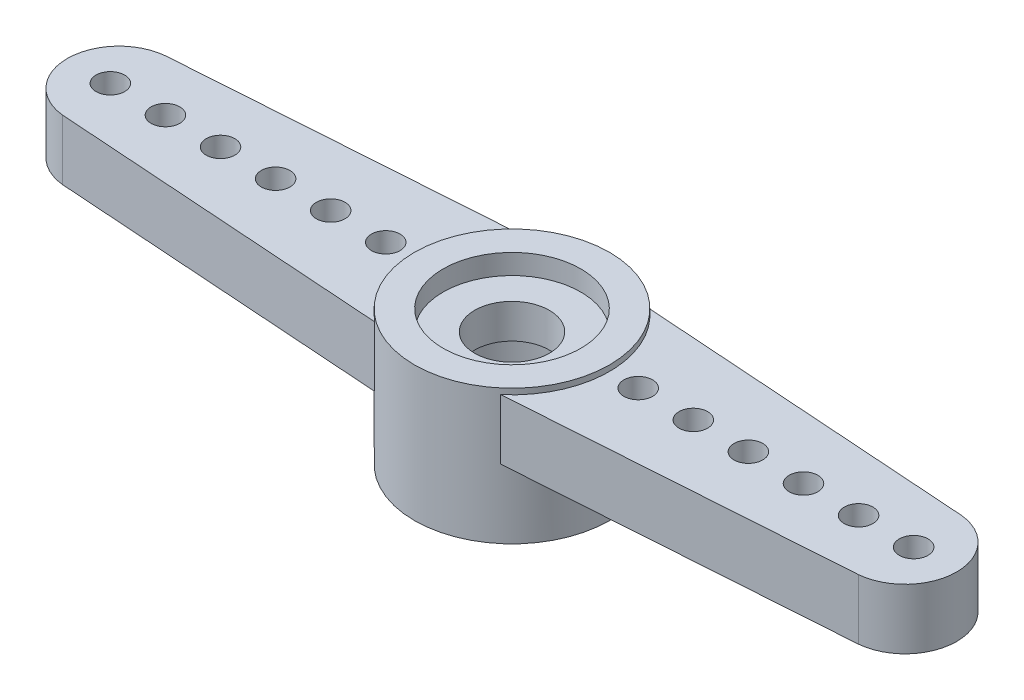
ISO-10303-21;
HEADER;
FILE_DESCRIPTION(('STEP AP214'),'2;1');
FILE_NAME('part.step','',(''),(''),'','','');
FILE_SCHEMA(('AUTOMOTIVE_DESIGN { 1 0 10303 214 1 1 1 1 }'));
ENDSEC;
DATA;
#1=APPLICATION_CONTEXT('core data for automotive mechanical design processes');
#2=APPLICATION_PROTOCOL_DEFINITION('international standard','automotive_design',2000,#1);
#3=PRODUCT_CONTEXT('',#1,'mechanical');
#4=PRODUCT('Part','Part','',(#3));
#5=PRODUCT_RELATED_PRODUCT_CATEGORY('part','',(#4));
#6=PRODUCT_DEFINITION_FORMATION('','',#4);
#7=PRODUCT_DEFINITION_CONTEXT('part definition',#1,'design');
#8=PRODUCT_DEFINITION('design','',#6,#7);
#9=PRODUCT_DEFINITION_SHAPE('','',#8);
#10=(LENGTH_UNIT() NAMED_UNIT(*) SI_UNIT(.MILLI.,.METRE.));
#11=(NAMED_UNIT(*) PLANE_ANGLE_UNIT() SI_UNIT($,.RADIAN.));
#12=(NAMED_UNIT(*) SI_UNIT($,.STERADIAN.) SOLID_ANGLE_UNIT());
#13=UNCERTAINTY_MEASURE_WITH_UNIT(LENGTH_MEASURE(1.E-05),#10,'distance_accuracy_value','');
#14=(GEOMETRIC_REPRESENTATION_CONTEXT(3) GLOBAL_UNCERTAINTY_ASSIGNED_CONTEXT((#13)) GLOBAL_UNIT_ASSIGNED_CONTEXT((#10,
#11,#12)) REPRESENTATION_CONTEXT('',''));
#15=CARTESIAN_POINT('',(0.,0.,0.));
#16=DIRECTION('',(0.,0.,1.));
#17=DIRECTION('',(1.,0.,0.));
#18=AXIS2_PLACEMENT_3D('',#15,#16,#17);
#19=CARTESIAN_POINT('',(0.,0.,0.));
#20=DIRECTION('',(0.,-1.,0.));
#21=DIRECTION('',(0.,0.,-1.));
#22=AXIS2_PLACEMENT_3D('',#19,#20,#21);
#23=PLANE('',#22);
#24=CARTESIAN_POINT('',(0.,0.,0.));
#25=DIRECTION('',(0.,1.,0.));
#26=DIRECTION('',(1.,0.,0.));
#27=AXIS2_PLACEMENT_3D('',#24,#25,#26);
#28=CIRCLE('',#27,2.4);
#29=CARTESIAN_POINT('',(-2.4,0.,0.));
#30=VERTEX_POINT('',#29);
#31=EDGE_CURVE('E529',#30,#30,#28,.T.);
#32=ORIENTED_EDGE('',*,*,#31,.F.);
#33=EDGE_LOOP('',(#32));
#34=FACE_BOUND('',#33,.T.);
#35=CARTESIAN_POINT('',(0.,0.,0.));
#36=DIRECTION('',(0.,-1.,0.));
#37=DIRECTION('',(1.,0.,0.));
#38=AXIS2_PLACEMENT_3D('',#35,#36,#37);
#39=CIRCLE('',#38,3.4);
#40=CARTESIAN_POINT('',(-3.4,0.,0.));
#41=VERTEX_POINT('',#40);
#42=EDGE_CURVE('E11',#41,#41,#39,.T.);
#43=ORIENTED_EDGE('',*,*,#42,.F.);
#44=EDGE_LOOP('',(#43));
#45=FACE_BOUND('',#44,.T.);
#46=ADVANCED_FACE('F16',(#34,#45),#23,.F.);
#47=CARTESIAN_POINT('',(0.,-4.7,0.));
#48=DIRECTION('',(0.,-1.,0.));
#49=DIRECTION('',(0.,0.,-1.));
#50=AXIS2_PLACEMENT_3D('',#47,#48,#49);
#51=PLANE('',#50);
#52=CARTESIAN_POINT('',(0.,-4.7,0.));
#53=DIRECTION('',(0.,1.,0.));
#54=DIRECTION('',(1.,0.,0.));
#55=AXIS2_PLACEMENT_3D('',#52,#53,#54);
#56=CIRCLE('',#55,2.4);
#57=CARTESIAN_POINT('',(-2.4,-4.7,0.));
#58=VERTEX_POINT('',#57);
#59=EDGE_CURVE('E307',#58,#58,#56,.T.);
#60=ORIENTED_EDGE('',*,*,#59,.T.);
#61=EDGE_LOOP('',(#60));
#62=FACE_BOUND('',#61,.T.);
#63=CARTESIAN_POINT('',(0.,-4.7,0.));
#64=DIRECTION('',(0.,-1.,0.));
#65=DIRECTION('',(1.,0.,0.));
#66=AXIS2_PLACEMENT_3D('',#63,#64,#65);
#67=CIRCLE('',#66,3.4);
#68=CARTESIAN_POINT('',(-3.4,-4.7,0.));
#69=VERTEX_POINT('',#68);
#70=EDGE_CURVE('E314',#69,#69,#67,.T.);
#71=ORIENTED_EDGE('',*,*,#70,.T.);
#72=EDGE_LOOP('',(#71));
#73=FACE_BOUND('',#72,.T.);
#74=ADVANCED_FACE('F594',(#62,#73),#51,.T.);
#75=CARTESIAN_POINT('',(0.,0.,0.));
#76=DIRECTION('',(0.,-1.,0.));
#77=DIRECTION('',(1.,0.,0.));
#78=AXIS2_PLACEMENT_3D('',#75,#76,#77);
#79=CYLINDRICAL_SURFACE('',#78,3.4);
#80=DIRECTION('',(0.,-1.,0.));
#81=VECTOR('',#80,1.);
#82=CARTESIAN_POINT('',(2.2,0.,-2.59229627936314));
#83=LINE('',#82,#81);
#84=CARTESIAN_POINT('',(2.2,-0.2,-2.59229627936314));
#85=VERTEX_POINT('',#84);
#86=CARTESIAN_POINT('',(2.2,-2.3,-2.59229627936314));
#87=VERTEX_POINT('',#86);
#88=EDGE_CURVE('E414',#85,#87,#83,.T.);
#89=ORIENTED_EDGE('',*,*,#88,.T.);
#90=CARTESIAN_POINT('',(0.,-2.3,0.));
#91=DIRECTION('',(0.,-1.,0.));
#92=DIRECTION('',(1.,0.,0.));
#93=AXIS2_PLACEMENT_3D('',#90,#91,#92);
#94=CIRCLE('',#93,3.4);
#95=CARTESIAN_POINT('',(2.2,-2.3,2.59229627936314));
#96=VERTEX_POINT('',#95);
#97=EDGE_CURVE('E417',#87,#96,#94,.T.);
#98=ORIENTED_EDGE('',*,*,#97,.T.);
#99=DIRECTION('',(0.,1.,0.));
#100=VECTOR('',#99,1.);
#101=CARTESIAN_POINT('',(2.2,0.,2.59229627936314));
#102=LINE('',#101,#100);
#103=CARTESIAN_POINT('',(2.2,-0.2,2.59229627936314));
#104=VERTEX_POINT('',#103);
#105=EDGE_CURVE('E389',#96,#104,#102,.T.);
#106=ORIENTED_EDGE('',*,*,#105,.T.);
#107=CARTESIAN_POINT('',(0.,-0.2,0.));
#108=DIRECTION('',(0.,1.,0.));
#109=DIRECTION('',(1.,0.,0.));
#110=AXIS2_PLACEMENT_3D('',#107,#108,#109);
#111=CIRCLE('',#110,3.4);
#112=EDGE_CURVE('E419',#104,#85,#111,.T.);
#113=ORIENTED_EDGE('',*,*,#112,.T.);
#114=EDGE_LOOP('',(#89,#98,#106,#113));
#115=FACE_BOUND('',#114,.T.);
#116=ORIENTED_EDGE('',*,*,#70,.F.);
#117=DIRECTION('',(0.,1.,0.));
#118=VECTOR('',#117,1.);
#119=CARTESIAN_POINT('',(-3.4,0.,0.));
#120=LINE('',#119,#118);
#121=CARTESIAN_POINT('',(-3.4,-2.3,0.));
#122=VERTEX_POINT('',#121);
#123=EDGE_CURVE('E45',#69,#122,#120,.T.);
#124=ORIENTED_EDGE('',*,*,#123,.T.);
#125=CARTESIAN_POINT('',(0.,-2.3,0.));
#126=DIRECTION('',(0.,-1.,0.));
#127=DIRECTION('',(1.,0.,0.));
#128=AXIS2_PLACEMENT_3D('',#125,#126,#127);
#129=CIRCLE('',#128,3.4);
#130=CARTESIAN_POINT('',(-2.2,-2.3,-2.59229627936314));
#131=VERTEX_POINT('',#130);
#132=EDGE_CURVE('E277',#122,#131,#129,.T.);
#133=ORIENTED_EDGE('',*,*,#132,.T.);
#134=DIRECTION('',(0.,1.,0.));
#135=VECTOR('',#134,1.);
#136=CARTESIAN_POINT('',(-2.2,0.,-2.59229627936314));
#137=LINE('',#136,#135);
#138=CARTESIAN_POINT('',(-2.2,-0.2,-2.59229627936314));
#139=VERTEX_POINT('',#138);
#140=EDGE_CURVE('E300',#131,#139,#137,.T.);
#141=ORIENTED_EDGE('',*,*,#140,.T.);
#142=CARTESIAN_POINT('',(0.,-0.2,0.));
#143=DIRECTION('',(0.,1.,0.));
#144=DIRECTION('',(1.,0.,0.));
#145=AXIS2_PLACEMENT_3D('',#142,#143,#144);
#146=CIRCLE('',#145,3.4);
#147=CARTESIAN_POINT('',(-3.4,-0.2,0.));
#148=VERTEX_POINT('',#147);
#149=EDGE_CURVE('E304',#139,#148,#146,.T.);
#150=ORIENTED_EDGE('',*,*,#149,.T.);
#151=DIRECTION('',(0.,1.,0.));
#152=VECTOR('',#151,1.);
#153=CARTESIAN_POINT('',(-3.4,0.,0.));
#154=LINE('',#153,#152);
#155=EDGE_CURVE('E24',#148,#41,#154,.T.);
#156=ORIENTED_EDGE('',*,*,#155,.T.);
#157=ORIENTED_EDGE('',*,*,#42,.T.);
#158=ORIENTED_EDGE('',*,*,#155,.F.);
#159=CARTESIAN_POINT('',(0.,-0.2,0.));
#160=DIRECTION('',(0.,1.,0.));
#161=DIRECTION('',(1.,0.,0.));
#162=AXIS2_PLACEMENT_3D('',#159,#160,#161);
#163=CIRCLE('',#162,3.4);
#164=CARTESIAN_POINT('',(-2.2,-0.2,2.59229627936314));
#165=VERTEX_POINT('',#164);
#166=EDGE_CURVE('E299',#148,#165,#163,.T.);
#167=ORIENTED_EDGE('',*,*,#166,.T.);
#168=DIRECTION('',(0.,-1.,0.));
#169=VECTOR('',#168,1.);
#170=CARTESIAN_POINT('',(-2.2,0.,2.59229627936314));
#171=LINE('',#170,#169);
#172=CARTESIAN_POINT('',(-2.2,-2.3,2.59229627936314));
#173=VERTEX_POINT('',#172);
#174=EDGE_CURVE('E291',#165,#173,#171,.T.);
#175=ORIENTED_EDGE('',*,*,#174,.T.);
#176=CARTESIAN_POINT('',(0.,-2.3,0.));
#177=DIRECTION('',(0.,-1.,0.));
#178=DIRECTION('',(1.,0.,0.));
#179=AXIS2_PLACEMENT_3D('',#176,#177,#178);
#180=CIRCLE('',#179,3.4);
#181=EDGE_CURVE('E276',#173,#122,#180,.T.);
#182=ORIENTED_EDGE('',*,*,#181,.T.);
#183=ORIENTED_EDGE('',*,*,#123,.F.);
#184=EDGE_LOOP('',(#116,#124,#133,#141,#150,#156,#157,#158,#167,#175,#182,#183));
#185=FACE_BOUND('',#184,.T.);
#186=ADVANCED_FACE('F599',(#115,#185),#79,.T.);
#187=CARTESIAN_POINT('',(0.,0.,0.));
#188=DIRECTION('',(0.,-1.,0.));
#189=DIRECTION('',(1.,0.,0.));
#190=AXIS2_PLACEMENT_3D('',#187,#188,#189);
#191=CYLINDRICAL_SURFACE('',#190,2.4);
#192=ORIENTED_EDGE('',*,*,#59,.F.);
#193=DIRECTION('',(0.,1.,0.));
#194=VECTOR('',#193,1.);
#195=CARTESIAN_POINT('',(-2.4,0.,0.));
#196=LINE('',#195,#194);
#197=CARTESIAN_POINT('',(-2.4,-1.9,0.));
#198=VERTEX_POINT('',#197);
#199=EDGE_CURVE('E313',#58,#198,#196,.T.);
#200=ORIENTED_EDGE('',*,*,#199,.T.);
#201=CARTESIAN_POINT('',(0.,-1.9,0.));
#202=DIRECTION('',(0.,1.,0.));
#203=DIRECTION('',(1.,0.,0.));
#204=AXIS2_PLACEMENT_3D('',#201,#202,#203);
#205=CIRCLE('',#204,2.4);
#206=EDGE_CURVE('E555',#198,#198,#205,.T.);
#207=ORIENTED_EDGE('',*,*,#206,.T.);
#208=ORIENTED_EDGE('',*,*,#199,.F.);
#209=EDGE_LOOP('',(#192,#200,#207,#208));
#210=FACE_BOUND('',#209,.T.);
#211=ADVANCED_FACE('F446',(#210),#191,.F.);
#212=CARTESIAN_POINT('',(-8.85,-0.2,0.));
#213=DIRECTION('',(0.,-1.,0.));
#214=DIRECTION('',(0.,0.,-1.));
#215=AXIS2_PLACEMENT_3D('',#212,#213,#214);
#216=PLANE('',#215);
#217=CARTESIAN_POINT('',(-12.08,-0.2,0.));
#218=DIRECTION('',(0.,1.,0.));
#219=DIRECTION('',(1.,0.,0.));
#220=AXIS2_PLACEMENT_3D('',#217,#218,#219);
#221=CIRCLE('',#220,0.5);
#222=CARTESIAN_POINT('',(-12.58,-0.2,0.));
#223=VERTEX_POINT('',#222);
#224=EDGE_CURVE('E430',#223,#223,#221,.T.);
#225=ORIENTED_EDGE('',*,*,#224,.F.);
#226=EDGE_LOOP('',(#225));
#227=FACE_BOUND('',#226,.T.);
#228=CARTESIAN_POINT('',(-4.4,-0.2,0.));
#229=DIRECTION('',(0.,1.,0.));
#230=DIRECTION('',(1.,0.,0.));
#231=AXIS2_PLACEMENT_3D('',#228,#229,#230);
#232=CIRCLE('',#231,0.5);
#233=CARTESIAN_POINT('',(-4.9,-0.2,0.));
#234=VERTEX_POINT('',#233);
#235=EDGE_CURVE('E332',#234,#234,#232,.T.);
#236=ORIENTED_EDGE('',*,*,#235,.F.);
#237=EDGE_LOOP('',(#236));
#238=FACE_BOUND('',#237,.T.);
#239=CARTESIAN_POINT('',(-6.32,-0.2,0.));
#240=DIRECTION('',(0.,1.,0.));
#241=DIRECTION('',(1.,0.,0.));
#242=AXIS2_PLACEMENT_3D('',#239,#240,#241);
#243=CIRCLE('',#242,0.5);
#244=CARTESIAN_POINT('',(-6.82,-0.2,0.));
#245=VERTEX_POINT('',#244);
#246=EDGE_CURVE('E345',#245,#245,#243,.T.);
#247=ORIENTED_EDGE('',*,*,#246,.F.);
#248=EDGE_LOOP('',(#247));
#249=FACE_BOUND('',#248,.T.);
#250=CARTESIAN_POINT('',(-8.24,-0.2,0.));
#251=DIRECTION('',(0.,1.,0.));
#252=DIRECTION('',(1.,0.,0.));
#253=AXIS2_PLACEMENT_3D('',#250,#251,#252);
#254=CIRCLE('',#253,0.5);
#255=CARTESIAN_POINT('',(-8.74,-0.2,0.));
#256=VERTEX_POINT('',#255);
#257=EDGE_CURVE('E236',#256,#256,#254,.T.);
#258=ORIENTED_EDGE('',*,*,#257,.F.);
#259=EDGE_LOOP('',(#258));
#260=FACE_BOUND('',#259,.T.);
#261=CARTESIAN_POINT('',(-10.16,-0.2,0.));
#262=DIRECTION('',(0.,1.,0.));
#263=DIRECTION('',(1.,0.,0.));
#264=AXIS2_PLACEMENT_3D('',#261,#262,#263);
#265=CIRCLE('',#264,0.5);
#266=CARTESIAN_POINT('',(-10.66,-0.2,0.));
#267=VERTEX_POINT('',#266);
#268=EDGE_CURVE('E257',#267,#267,#265,.T.);
#269=ORIENTED_EDGE('',*,*,#268,.F.);
#270=EDGE_LOOP('',(#269));
#271=FACE_BOUND('',#270,.T.);
#272=CARTESIAN_POINT('',(-14.,-0.2,0.));
#273=DIRECTION('',(0.,1.,0.));
#274=DIRECTION('',(1.,0.,0.));
#275=AXIS2_PLACEMENT_3D('',#272,#273,#274);
#276=CIRCLE('',#275,0.5);
#277=CARTESIAN_POINT('',(-14.5,-0.2,0.));
#278=VERTEX_POINT('',#277);
#279=EDGE_CURVE('E263',#278,#278,#276,.T.);
#280=ORIENTED_EDGE('',*,*,#279,.F.);
#281=EDGE_LOOP('',(#280));
#282=FACE_BOUND('',#281,.T.);
#283=DIRECTION('',(0.997655533569589,0.,-0.0684356364621374));
#284=VECTOR('',#283,1.);
#285=CARTESIAN_POINT('',(-13.8763650385714,-0.2,-1.79133898890459));
#286=LINE('',#285,#284);
#287=CARTESIAN_POINT('',(-13.8763650385714,-0.2,-1.79133898890459));
#288=VERTEX_POINT('',#287);
#289=EDGE_CURVE('E293',#288,#139,#286,.T.);
#290=ORIENTED_EDGE('',*,*,#289,.F.);
#291=CARTESIAN_POINT('',(-13.7,-0.2,0.));
#292=DIRECTION('',(0.,-1.,0.));
#293=DIRECTION('',(-0.0979805805732178,0.,0.995188326815852));
#294=AXIS2_PLACEMENT_3D('',#291,#292,#293);
#295=CIRCLE('',#294,1.8);
#296=CARTESIAN_POINT('',(-13.8763650385714,-0.2,1.79133898890459));
#297=VERTEX_POINT('',#296);
#298=EDGE_CURVE('E266',#297,#288,#295,.T.);
#299=ORIENTED_EDGE('',*,*,#298,.F.);
#300=DIRECTION('',(0.997655533569589,0.,0.0684356364621374));
#301=VECTOR('',#300,1.);
#302=CARTESIAN_POINT('',(-13.8763650385714,-0.2,1.79133898890459));
#303=LINE('',#302,#301);
#304=EDGE_CURVE('E285',#297,#165,#303,.T.);
#305=ORIENTED_EDGE('',*,*,#304,.T.);
#306=ORIENTED_EDGE('',*,*,#166,.F.);
#307=ORIENTED_EDGE('',*,*,#149,.F.);
#308=EDGE_LOOP('',(#290,#299,#305,#306,#307));
#309=FACE_BOUND('',#308,.T.);
#310=ADVANCED_FACE('F354',(#227,#238,#249,#260,#271,#282,#309),#216,.F.);
#311=CARTESIAN_POINT('',(-8.85,-2.3,0.));
#312=DIRECTION('',(0.,-1.,0.));
#313=DIRECTION('',(0.,0.,-1.));
#314=AXIS2_PLACEMENT_3D('',#311,#312,#313);
#315=PLANE('',#314);
#316=CARTESIAN_POINT('',(-12.08,-2.3,0.));
#317=DIRECTION('',(0.,1.,0.));
#318=DIRECTION('',(1.,0.,0.));
#319=AXIS2_PLACEMENT_3D('',#316,#317,#318);
#320=CIRCLE('',#319,0.5);
#321=CARTESIAN_POINT('',(-12.58,-2.3,0.));
#322=VERTEX_POINT('',#321);
#323=EDGE_CURVE('E425',#322,#322,#320,.T.);
#324=ORIENTED_EDGE('',*,*,#323,.T.);
#325=EDGE_LOOP('',(#324));
#326=FACE_BOUND('',#325,.T.);
#327=CARTESIAN_POINT('',(-4.4,-2.3,0.));
#328=DIRECTION('',(0.,1.,0.));
#329=DIRECTION('',(1.,0.,0.));
#330=AXIS2_PLACEMENT_3D('',#327,#328,#329);
#331=CIRCLE('',#330,0.5);
#332=CARTESIAN_POINT('',(-4.9,-2.3,0.));
#333=VERTEX_POINT('',#332);
#334=EDGE_CURVE('E324',#333,#333,#331,.T.);
#335=ORIENTED_EDGE('',*,*,#334,.T.);
#336=EDGE_LOOP('',(#335));
#337=FACE_BOUND('',#336,.T.);
#338=CARTESIAN_POINT('',(-6.32,-2.3,0.));
#339=DIRECTION('',(0.,1.,0.));
#340=DIRECTION('',(1.,0.,0.));
#341=AXIS2_PLACEMENT_3D('',#338,#339,#340);
#342=CIRCLE('',#341,0.5);
#343=CARTESIAN_POINT('',(-6.82,-2.3,0.));
#344=VERTEX_POINT('',#343);
#345=EDGE_CURVE('E331',#344,#344,#342,.T.);
#346=ORIENTED_EDGE('',*,*,#345,.T.);
#347=EDGE_LOOP('',(#346));
#348=FACE_BOUND('',#347,.T.);
#349=CARTESIAN_POINT('',(-8.24,-2.3,0.));
#350=DIRECTION('',(0.,1.,0.));
#351=DIRECTION('',(1.,0.,0.));
#352=AXIS2_PLACEMENT_3D('',#349,#350,#351);
#353=CIRCLE('',#352,0.5);
#354=CARTESIAN_POINT('',(-8.74,-2.3,0.));
#355=VERTEX_POINT('',#354);
#356=EDGE_CURVE('E255',#355,#355,#353,.T.);
#357=ORIENTED_EDGE('',*,*,#356,.T.);
#358=EDGE_LOOP('',(#357));
#359=FACE_BOUND('',#358,.T.);
#360=CARTESIAN_POINT('',(-10.16,-2.3,0.));
#361=DIRECTION('',(0.,1.,0.));
#362=DIRECTION('',(1.,0.,0.));
#363=AXIS2_PLACEMENT_3D('',#360,#361,#362);
#364=CIRCLE('',#363,0.5);
#365=CARTESIAN_POINT('',(-10.66,-2.3,0.));
#366=VERTEX_POINT('',#365);
#367=EDGE_CURVE('E243',#366,#366,#364,.T.);
#368=ORIENTED_EDGE('',*,*,#367,.T.);
#369=EDGE_LOOP('',(#368));
#370=FACE_BOUND('',#369,.T.);
#371=CARTESIAN_POINT('',(-14.,-2.3,0.));
#372=DIRECTION('',(0.,1.,0.));
#373=DIRECTION('',(1.,0.,0.));
#374=AXIS2_PLACEMENT_3D('',#371,#372,#373);
#375=CIRCLE('',#374,0.5);
#376=CARTESIAN_POINT('',(-14.5,-2.3,0.));
#377=VERTEX_POINT('',#376);
#378=EDGE_CURVE('E260',#377,#377,#375,.T.);
#379=ORIENTED_EDGE('',*,*,#378,.T.);
#380=EDGE_LOOP('',(#379));
#381=FACE_BOUND('',#380,.T.);
#382=DIRECTION('',(0.997655533569589,0.,-0.0684356364621374));
#383=VECTOR('',#382,1.);
#384=CARTESIAN_POINT('',(-13.8763650385714,-2.3,-1.79133898890459));
#385=LINE('',#384,#383);
#386=CARTESIAN_POINT('',(-13.8763650385714,-2.3,-1.79133898890459));
#387=VERTEX_POINT('',#386);
#388=EDGE_CURVE('E278',#387,#131,#385,.T.);
#389=ORIENTED_EDGE('',*,*,#388,.T.);
#390=ORIENTED_EDGE('',*,*,#132,.F.);
#391=ORIENTED_EDGE('',*,*,#181,.F.);
#392=DIRECTION('',(-0.997655533569589,0.,-0.0684356364621374));
#393=VECTOR('',#392,1.);
#394=CARTESIAN_POINT('',(-13.8763650385714,-2.3,1.79133898890459));
#395=LINE('',#394,#393);
#396=CARTESIAN_POINT('',(-13.8763650385714,-2.3,1.79133898890459));
#397=VERTEX_POINT('',#396);
#398=EDGE_CURVE('E287',#173,#397,#395,.T.);
#399=ORIENTED_EDGE('',*,*,#398,.T.);
#400=CARTESIAN_POINT('',(-13.7,-2.3,0.));
#401=DIRECTION('',(0.,-1.,0.));
#402=DIRECTION('',(-0.0979805805732178,0.,0.995188326815852));
#403=AXIS2_PLACEMENT_3D('',#400,#401,#402);
#404=CIRCLE('',#403,1.8);
#405=EDGE_CURVE('E274',#397,#387,#404,.T.);
#406=ORIENTED_EDGE('',*,*,#405,.T.);
#407=EDGE_LOOP('',(#389,#390,#391,#399,#406));
#408=FACE_BOUND('',#407,.T.);
#409=ADVANCED_FACE('F351',(#326,#337,#348,#359,#370,#381,#408),#315,.T.);
#410=CARTESIAN_POINT('',(-13.8763650385714,-0.2,-1.79133898890459));
#411=DIRECTION('',(-0.0684356364621374,0.,-0.997655533569589));
#412=DIRECTION('',(-0.997655533569589,0.,0.0684356364621374));
#413=AXIS2_PLACEMENT_3D('',#410,#411,#412);
#414=PLANE('',#413);
#415=ORIENTED_EDGE('',*,*,#289,.T.);
#416=ORIENTED_EDGE('',*,*,#140,.F.);
#417=ORIENTED_EDGE('',*,*,#388,.F.);
#418=DIRECTION('',(0.,-1.,0.));
#419=VECTOR('',#418,1.);
#420=CARTESIAN_POINT('',(-13.8763650385714,-0.2,-1.79133898890459));
#421=LINE('',#420,#419);
#422=EDGE_CURVE('E271',#288,#387,#421,.T.);
#423=ORIENTED_EDGE('',*,*,#422,.F.);
#424=EDGE_LOOP('',(#415,#416,#417,#423));
#425=FACE_BOUND('',#424,.T.);
#426=ADVANCED_FACE('F353',(#425),#414,.T.);
#427=CARTESIAN_POINT('',(-2.2,-0.2,2.59229627936314));
#428=DIRECTION('',(-0.0684356364621374,0.,0.997655533569589));
#429=DIRECTION('',(0.,1.,0.));
#430=AXIS2_PLACEMENT_3D('',#427,#428,#429);
#431=PLANE('',#430);
#432=ORIENTED_EDGE('',*,*,#304,.F.);
#433=DIRECTION('',(0.,-1.,0.));
#434=VECTOR('',#433,1.);
#435=CARTESIAN_POINT('',(-13.8763650385714,-0.2,1.79133898890459));
#436=LINE('',#435,#434);
#437=EDGE_CURVE('E283',#297,#397,#436,.T.);
#438=ORIENTED_EDGE('',*,*,#437,.T.);
#439=ORIENTED_EDGE('',*,*,#398,.F.);
#440=ORIENTED_EDGE('',*,*,#174,.F.);
#441=EDGE_LOOP('',(#432,#438,#439,#440));
#442=FACE_BOUND('',#441,.T.);
#443=ADVANCED_FACE('F650',(#442),#431,.T.);
#444=CARTESIAN_POINT('',(-13.7,-0.2,0.));
#445=DIRECTION('',(0.,-1.,0.));
#446=DIRECTION('',(-0.0979805805732178,0.,0.995188326815852));
#447=AXIS2_PLACEMENT_3D('',#444,#445,#446);
#448=CYLINDRICAL_SURFACE('',#447,1.8);
#449=ORIENTED_EDGE('',*,*,#298,.T.);
#450=ORIENTED_EDGE('',*,*,#422,.T.);
#451=ORIENTED_EDGE('',*,*,#405,.F.);
#452=ORIENTED_EDGE('',*,*,#437,.F.);
#453=EDGE_LOOP('',(#449,#450,#451,#452));
#454=FACE_BOUND('',#453,.T.);
#455=ADVANCED_FACE('F459',(#454),#448,.T.);
#456=CARTESIAN_POINT('',(-14.,-0.2,0.));
#457=DIRECTION('',(0.,-1.,0.));
#458=DIRECTION('',(1.,0.,0.));
#459=AXIS2_PLACEMENT_3D('',#456,#457,#458);
#460=CYLINDRICAL_SURFACE('',#459,0.5);
#461=ORIENTED_EDGE('',*,*,#378,.F.);
#462=DIRECTION('',(0.,1.,0.));
#463=VECTOR('',#462,1.);
#464=CARTESIAN_POINT('',(-14.5,-0.2,0.));
#465=LINE('',#464,#463);
#466=EDGE_CURVE('E270',#377,#278,#465,.T.);
#467=ORIENTED_EDGE('',*,*,#466,.T.);
#468=ORIENTED_EDGE('',*,*,#279,.T.);
#469=ORIENTED_EDGE('',*,*,#466,.F.);
#470=EDGE_LOOP('',(#461,#467,#468,#469));
#471=FACE_BOUND('',#470,.T.);
#472=ADVANCED_FACE('F646',(#471),#460,.F.);
#473=CARTESIAN_POINT('',(-10.16,-0.2,0.));
#474=DIRECTION('',(0.,-1.,0.));
#475=DIRECTION('',(1.,0.,0.));
#476=AXIS2_PLACEMENT_3D('',#473,#474,#475);
#477=CYLINDRICAL_SURFACE('',#476,0.5);
#478=ORIENTED_EDGE('',*,*,#367,.F.);
#479=DIRECTION('',(0.,1.,0.));
#480=VECTOR('',#479,1.);
#481=CARTESIAN_POINT('',(-10.66,-0.2,0.));
#482=LINE('',#481,#480);
#483=EDGE_CURVE('E252',#366,#267,#482,.T.);
#484=ORIENTED_EDGE('',*,*,#483,.T.);
#485=ORIENTED_EDGE('',*,*,#268,.T.);
#486=ORIENTED_EDGE('',*,*,#483,.F.);
#487=EDGE_LOOP('',(#478,#484,#485,#486));
#488=FACE_BOUND('',#487,.T.);
#489=ADVANCED_FACE('F661',(#488),#477,.F.);
#490=CARTESIAN_POINT('',(-8.24,-0.2,0.));
#491=DIRECTION('',(0.,-1.,0.));
#492=DIRECTION('',(1.,0.,0.));
#493=AXIS2_PLACEMENT_3D('',#490,#491,#492);
#494=CYLINDRICAL_SURFACE('',#493,0.5);
#495=ORIENTED_EDGE('',*,*,#356,.F.);
#496=DIRECTION('',(0.,1.,0.));
#497=VECTOR('',#496,1.);
#498=CARTESIAN_POINT('',(-8.74,-0.2,0.));
#499=LINE('',#498,#497);
#500=EDGE_CURVE('E239',#355,#256,#499,.T.);
#501=ORIENTED_EDGE('',*,*,#500,.T.);
#502=ORIENTED_EDGE('',*,*,#257,.T.);
#503=ORIENTED_EDGE('',*,*,#500,.F.);
#504=EDGE_LOOP('',(#495,#501,#502,#503));
#505=FACE_BOUND('',#504,.T.);
#506=ADVANCED_FACE('F237',(#505),#494,.F.);
#507=CARTESIAN_POINT('',(-6.32,-0.2,0.));
#508=DIRECTION('',(0.,-1.,0.));
#509=DIRECTION('',(1.,0.,0.));
#510=AXIS2_PLACEMENT_3D('',#507,#508,#509);
#511=CYLINDRICAL_SURFACE('',#510,0.5);
#512=ORIENTED_EDGE('',*,*,#345,.F.);
#513=DIRECTION('',(0.,1.,0.));
#514=VECTOR('',#513,1.);
#515=CARTESIAN_POINT('',(-6.82,-0.2,0.));
#516=LINE('',#515,#514);
#517=EDGE_CURVE('E339',#344,#245,#516,.T.);
#518=ORIENTED_EDGE('',*,*,#517,.T.);
#519=ORIENTED_EDGE('',*,*,#246,.T.);
#520=ORIENTED_EDGE('',*,*,#517,.F.);
#521=EDGE_LOOP('',(#512,#518,#519,#520));
#522=FACE_BOUND('',#521,.T.);
#523=ADVANCED_FACE('F587',(#522),#511,.F.);
#524=CARTESIAN_POINT('',(-4.4,-0.2,0.));
#525=DIRECTION('',(0.,-1.,0.));
#526=DIRECTION('',(1.,0.,0.));
#527=AXIS2_PLACEMENT_3D('',#524,#525,#526);
#528=CYLINDRICAL_SURFACE('',#527,0.5);
#529=ORIENTED_EDGE('',*,*,#334,.F.);
#530=DIRECTION('',(0.,1.,0.));
#531=VECTOR('',#530,1.);
#532=CARTESIAN_POINT('',(-4.9,-0.2,0.));
#533=LINE('',#532,#531);
#534=EDGE_CURVE('E330',#333,#234,#533,.T.);
#535=ORIENTED_EDGE('',*,*,#534,.T.);
#536=ORIENTED_EDGE('',*,*,#235,.T.);
#537=ORIENTED_EDGE('',*,*,#534,.F.);
#538=EDGE_LOOP('',(#529,#535,#536,#537));
#539=FACE_BOUND('',#538,.T.);
#540=ADVANCED_FACE('F442',(#539),#528,.F.);
#541=CARTESIAN_POINT('',(-12.08,-0.2,0.));
#542=DIRECTION('',(0.,-1.,0.));
#543=DIRECTION('',(1.,0.,0.));
#544=AXIS2_PLACEMENT_3D('',#541,#542,#543);
#545=CYLINDRICAL_SURFACE('',#544,0.5);
#546=ORIENTED_EDGE('',*,*,#323,.F.);
#547=DIRECTION('',(0.,1.,0.));
#548=VECTOR('',#547,1.);
#549=CARTESIAN_POINT('',(-12.58,-0.2,0.));
#550=LINE('',#549,#548);
#551=EDGE_CURVE('E424',#322,#223,#550,.T.);
#552=ORIENTED_EDGE('',*,*,#551,.T.);
#553=ORIENTED_EDGE('',*,*,#224,.T.);
#554=ORIENTED_EDGE('',*,*,#551,.F.);
#555=EDGE_LOOP('',(#546,#552,#553,#554));
#556=FACE_BOUND('',#555,.T.);
#557=ADVANCED_FACE('F579',(#556),#545,.F.);
#558=CARTESIAN_POINT('',(8.85,-0.2,0.));
#559=DIRECTION('',(0.,-1.,0.));
#560=DIRECTION('',(0.,0.,-1.));
#561=AXIS2_PLACEMENT_3D('',#558,#559,#560);
#562=PLANE('',#561);
#563=CARTESIAN_POINT('',(14.,-0.2,0.));
#564=DIRECTION('',(0.,1.,0.));
#565=DIRECTION('',(1.,0.,0.));
#566=AXIS2_PLACEMENT_3D('',#563,#564,#565);
#567=CIRCLE('',#566,0.5);
#568=CARTESIAN_POINT('',(13.5,-0.2,0.));
#569=VERTEX_POINT('',#568);
#570=EDGE_CURVE('E507',#569,#569,#567,.T.);
#571=ORIENTED_EDGE('',*,*,#570,.F.);
#572=EDGE_LOOP('',(#571));
#573=FACE_BOUND('',#572,.T.);
#574=CARTESIAN_POINT('',(6.32,-0.2,0.));
#575=DIRECTION('',(0.,1.,0.));
#576=DIRECTION('',(1.,0.,0.));
#577=AXIS2_PLACEMENT_3D('',#574,#575,#576);
#578=CIRCLE('',#577,0.5);
#579=CARTESIAN_POINT('',(5.82,-0.2,0.));
#580=VERTEX_POINT('',#579);
#581=EDGE_CURVE('E533',#580,#580,#578,.T.);
#582=ORIENTED_EDGE('',*,*,#581,.F.);
#583=EDGE_LOOP('',(#582));
#584=FACE_BOUND('',#583,.T.);
#585=CARTESIAN_POINT('',(12.08,-0.2,0.));
#586=DIRECTION('',(0.,1.,0.));
#587=DIRECTION('',(1.,0.,0.));
#588=AXIS2_PLACEMENT_3D('',#585,#586,#587);
#589=CIRCLE('',#588,0.5);
#590=CARTESIAN_POINT('',(11.58,-0.2,0.));
#591=VERTEX_POINT('',#590);
#592=EDGE_CURVE('E498',#591,#591,#589,.T.);
#593=ORIENTED_EDGE('',*,*,#592,.F.);
#594=EDGE_LOOP('',(#593));
#595=FACE_BOUND('',#594,.T.);
#596=CARTESIAN_POINT('',(10.16,-0.2,0.));
#597=DIRECTION('',(0.,1.,0.));
#598=DIRECTION('',(1.,0.,0.));
#599=AXIS2_PLACEMENT_3D('',#596,#597,#598);
#600=CIRCLE('',#599,0.5);
#601=CARTESIAN_POINT('',(9.66,-0.2,0.));
#602=VERTEX_POINT('',#601);
#603=EDGE_CURVE('E485',#602,#602,#600,.T.);
#604=ORIENTED_EDGE('',*,*,#603,.F.);
#605=EDGE_LOOP('',(#604));
#606=FACE_BOUND('',#605,.T.);
#607=CARTESIAN_POINT('',(8.24,-0.2,0.));
#608=DIRECTION('',(0.,1.,0.));
#609=DIRECTION('',(1.,0.,0.));
#610=AXIS2_PLACEMENT_3D('',#607,#608,#609);
#611=CIRCLE('',#610,0.5);
#612=CARTESIAN_POINT('',(7.74,-0.2,0.));
#613=VERTEX_POINT('',#612);
#614=EDGE_CURVE('E378',#613,#613,#611,.T.);
#615=ORIENTED_EDGE('',*,*,#614,.F.);
#616=EDGE_LOOP('',(#615));
#617=FACE_BOUND('',#616,.T.);
#618=CARTESIAN_POINT('',(4.4,-0.2,0.));
#619=DIRECTION('',(0.,1.,0.));
#620=DIRECTION('',(1.,0.,0.));
#621=AXIS2_PLACEMENT_3D('',#618,#619,#620);
#622=CIRCLE('',#621,0.5);
#623=CARTESIAN_POINT('',(3.9,-0.2,0.));
#624=VERTEX_POINT('',#623);
#625=EDGE_CURVE('E379',#624,#624,#622,.T.);
#626=ORIENTED_EDGE('',*,*,#625,.F.);
#627=EDGE_LOOP('',(#626));
#628=FACE_BOUND('',#627,.T.);
#629=DIRECTION('',(0.997655533569589,0.,0.0684356364621374));
#630=VECTOR('',#629,1.);
#631=CARTESIAN_POINT('',(2.2,-0.2,-2.59229627936314));
#632=LINE('',#631,#630);
#633=CARTESIAN_POINT('',(13.8763650385714,-0.2,-1.79133898890459));
#634=VERTEX_POINT('',#633);
#635=EDGE_CURVE('E410',#85,#634,#632,.T.);
#636=ORIENTED_EDGE('',*,*,#635,.F.);
#637=ORIENTED_EDGE('',*,*,#112,.F.);
#638=DIRECTION('',(0.997655533569589,0.,-0.0684356364621374));
#639=VECTOR('',#638,1.);
#640=CARTESIAN_POINT('',(2.2,-0.2,2.59229627936314));
#641=LINE('',#640,#639);
#642=CARTESIAN_POINT('',(13.8763650385714,-0.2,1.79133898890459));
#643=VERTEX_POINT('',#642);
#644=EDGE_CURVE('E382',#104,#643,#641,.T.);
#645=ORIENTED_EDGE('',*,*,#644,.T.);
#646=CARTESIAN_POINT('',(13.7,-0.2,0.));
#647=DIRECTION('',(0.,-1.,0.));
#648=DIRECTION('',(0.0979805769841036,0.,-0.995188327169216));
#649=AXIS2_PLACEMENT_3D('',#646,#647,#648);
#650=CIRCLE('',#649,1.8);
#651=EDGE_CURVE('E399',#634,#643,#650,.T.);
#652=ORIENTED_EDGE('',*,*,#651,.F.);
#653=EDGE_LOOP('',(#636,#637,#645,#652));
#654=FACE_BOUND('',#653,.T.);
#655=ADVANCED_FACE('F578',(#573,#584,#595,#606,#617,#628,#654),#562,.F.);
#656=CARTESIAN_POINT('',(8.85,-2.3,0.));
#657=DIRECTION('',(0.,-1.,0.));
#658=DIRECTION('',(0.,0.,-1.));
#659=AXIS2_PLACEMENT_3D('',#656,#657,#658);
#660=PLANE('',#659);
#661=CARTESIAN_POINT('',(14.,-2.3,0.));
#662=DIRECTION('',(0.,1.,0.));
#663=DIRECTION('',(1.,0.,0.));
#664=AXIS2_PLACEMENT_3D('',#661,#662,#663);
#665=CIRCLE('',#664,0.5);
#666=CARTESIAN_POINT('',(13.5,-2.3,0.));
#667=VERTEX_POINT('',#666);
#668=EDGE_CURVE('E519',#667,#667,#665,.T.);
#669=ORIENTED_EDGE('',*,*,#668,.T.);
#670=EDGE_LOOP('',(#669));
#671=FACE_BOUND('',#670,.T.);
#672=CARTESIAN_POINT('',(6.32,-2.3,0.));
#673=DIRECTION('',(0.,1.,0.));
#674=DIRECTION('',(1.,0.,0.));
#675=AXIS2_PLACEMENT_3D('',#672,#673,#674);
#676=CIRCLE('',#675,0.5);
#677=CARTESIAN_POINT('',(5.82,-2.3,0.));
#678=VERTEX_POINT('',#677);
#679=EDGE_CURVE('E511',#678,#678,#676,.T.);
#680=ORIENTED_EDGE('',*,*,#679,.T.);
#681=EDGE_LOOP('',(#680));
#682=FACE_BOUND('',#681,.T.);
#683=CARTESIAN_POINT('',(12.08,-2.3,0.));
#684=DIRECTION('',(0.,1.,0.));
#685=DIRECTION('',(1.,0.,0.));
#686=AXIS2_PLACEMENT_3D('',#683,#684,#685);
#687=CIRCLE('',#686,0.5);
#688=CARTESIAN_POINT('',(11.58,-2.3,0.));
#689=VERTEX_POINT('',#688);
#690=EDGE_CURVE('E505',#689,#689,#687,.T.);
#691=ORIENTED_EDGE('',*,*,#690,.T.);
#692=EDGE_LOOP('',(#691));
#693=FACE_BOUND('',#692,.T.);
#694=CARTESIAN_POINT('',(10.16,-2.3,0.));
#695=DIRECTION('',(0.,1.,0.));
#696=DIRECTION('',(1.,0.,0.));
#697=AXIS2_PLACEMENT_3D('',#694,#695,#696);
#698=CIRCLE('',#697,0.5);
#699=CARTESIAN_POINT('',(9.66,-2.3,0.));
#700=VERTEX_POINT('',#699);
#701=EDGE_CURVE('E493',#700,#700,#698,.T.);
#702=ORIENTED_EDGE('',*,*,#701,.T.);
#703=EDGE_LOOP('',(#702));
#704=FACE_BOUND('',#703,.T.);
#705=CARTESIAN_POINT('',(8.24,-2.3,0.));
#706=DIRECTION('',(0.,1.,0.));
#707=DIRECTION('',(1.,0.,0.));
#708=AXIS2_PLACEMENT_3D('',#705,#706,#707);
#709=CIRCLE('',#708,0.5);
#710=CARTESIAN_POINT('',(7.74,-2.3,0.));
#711=VERTEX_POINT('',#710);
#712=EDGE_CURVE('E466',#711,#711,#709,.T.);
#713=ORIENTED_EDGE('',*,*,#712,.T.);
#714=EDGE_LOOP('',(#713));
#715=FACE_BOUND('',#714,.T.);
#716=CARTESIAN_POINT('',(4.4,-2.3,0.));
#717=DIRECTION('',(0.,1.,0.));
#718=DIRECTION('',(1.,0.,0.));
#719=AXIS2_PLACEMENT_3D('',#716,#717,#718);
#720=CIRCLE('',#719,0.5);
#721=CARTESIAN_POINT('',(3.9,-2.3,0.));
#722=VERTEX_POINT('',#721);
#723=EDGE_CURVE('E477',#722,#722,#720,.T.);
#724=ORIENTED_EDGE('',*,*,#723,.T.);
#725=EDGE_LOOP('',(#724));
#726=FACE_BOUND('',#725,.T.);
#727=DIRECTION('',(0.997655533569589,0.,0.0684356364621374));
#728=VECTOR('',#727,1.);
#729=CARTESIAN_POINT('',(2.2,-2.3,-2.59229627936314));
#730=LINE('',#729,#728);
#731=CARTESIAN_POINT('',(13.8763650385714,-2.3,-1.79133898890459));
#732=VERTEX_POINT('',#731);
#733=EDGE_CURVE('E409',#87,#732,#730,.T.);
#734=ORIENTED_EDGE('',*,*,#733,.T.);
#735=CARTESIAN_POINT('',(13.7,-2.3,0.));
#736=DIRECTION('',(0.,-1.,0.));
#737=DIRECTION('',(0.0979805769841036,0.,-0.995188327169216));
#738=AXIS2_PLACEMENT_3D('',#735,#736,#737);
#739=CIRCLE('',#738,1.8);
#740=CARTESIAN_POINT('',(13.8763650385714,-2.3,1.79133898890459));
#741=VERTEX_POINT('',#740);
#742=EDGE_CURVE('E403',#732,#741,#739,.T.);
#743=ORIENTED_EDGE('',*,*,#742,.T.);
#744=DIRECTION('',(-0.997655533569589,0.,0.0684356364621374));
#745=VECTOR('',#744,1.);
#746=CARTESIAN_POINT('',(2.2,-2.3,2.59229627936314));
#747=LINE('',#746,#745);
#748=EDGE_CURVE('E392',#741,#96,#747,.T.);
#749=ORIENTED_EDGE('',*,*,#748,.T.);
#750=ORIENTED_EDGE('',*,*,#97,.F.);
#751=EDGE_LOOP('',(#734,#743,#749,#750));
#752=FACE_BOUND('',#751,.T.);
#753=ADVANCED_FACE('F590',(#671,#682,#693,#704,#715,#726,#752),#660,.T.);
#754=CARTESIAN_POINT('',(2.2,-0.2,-2.59229627936314));
#755=DIRECTION('',(0.0684356364621374,0.,-0.997655533569589));
#756=DIRECTION('',(0.,-1.,0.));
#757=AXIS2_PLACEMENT_3D('',#754,#755,#756);
#758=PLANE('',#757);
#759=ORIENTED_EDGE('',*,*,#635,.T.);
#760=DIRECTION('',(0.,-1.,0.));
#761=VECTOR('',#760,1.);
#762=CARTESIAN_POINT('',(13.8763650385714,-0.2,-1.79133898890459));
#763=LINE('',#762,#761);
#764=EDGE_CURVE('E404',#634,#732,#763,.T.);
#765=ORIENTED_EDGE('',*,*,#764,.T.);
#766=ORIENTED_EDGE('',*,*,#733,.F.);
#767=ORIENTED_EDGE('',*,*,#88,.F.);
#768=EDGE_LOOP('',(#759,#765,#766,#767));
#769=FACE_BOUND('',#768,.T.);
#770=ADVANCED_FACE('F635',(#769),#758,.T.);
#771=CARTESIAN_POINT('',(13.7,-0.2,0.));
#772=DIRECTION('',(0.,-1.,0.));
#773=DIRECTION('',(0.0979805769841036,0.,-0.995188327169216));
#774=AXIS2_PLACEMENT_3D('',#771,#772,#773);
#775=CYLINDRICAL_SURFACE('',#774,1.8);
#776=ORIENTED_EDGE('',*,*,#651,.T.);
#777=DIRECTION('',(0.,-1.,0.));
#778=VECTOR('',#777,1.);
#779=CARTESIAN_POINT('',(13.8763650385714,-0.2,1.79133898890459));
#780=LINE('',#779,#778);
#781=EDGE_CURVE('E396',#643,#741,#780,.T.);
#782=ORIENTED_EDGE('',*,*,#781,.T.);
#783=ORIENTED_EDGE('',*,*,#742,.F.);
#784=ORIENTED_EDGE('',*,*,#764,.F.);
#785=EDGE_LOOP('',(#776,#782,#783,#784));
#786=FACE_BOUND('',#785,.T.);
#787=ADVANCED_FACE('F652',(#786),#775,.T.);
#788=CARTESIAN_POINT('',(13.8763650385714,-0.2,1.79133898890459));
#789=DIRECTION('',(0.0684356364621374,0.,0.997655533569589));
#790=DIRECTION('',(0.,-1.,0.));
#791=AXIS2_PLACEMENT_3D('',#788,#789,#790);
#792=PLANE('',#791);
#793=ORIENTED_EDGE('',*,*,#644,.F.);
#794=ORIENTED_EDGE('',*,*,#105,.F.);
#795=ORIENTED_EDGE('',*,*,#748,.F.);
#796=ORIENTED_EDGE('',*,*,#781,.F.);
#797=EDGE_LOOP('',(#793,#794,#795,#796));
#798=FACE_BOUND('',#797,.T.);
#799=ADVANCED_FACE('F649',(#798),#792,.T.);
#800=CARTESIAN_POINT('',(4.4,-0.2,0.));
#801=DIRECTION('',(0.,-1.,0.));
#802=DIRECTION('',(1.,0.,0.));
#803=AXIS2_PLACEMENT_3D('',#800,#801,#802);
#804=CYLINDRICAL_SURFACE('',#803,0.5);
#805=ORIENTED_EDGE('',*,*,#723,.F.);
#806=DIRECTION('',(0.,1.,0.));
#807=VECTOR('',#806,1.);
#808=CARTESIAN_POINT('',(3.9,-0.2,0.));
#809=LINE('',#808,#807);
#810=EDGE_CURVE('E383',#722,#624,#809,.T.);
#811=ORIENTED_EDGE('',*,*,#810,.T.);
#812=ORIENTED_EDGE('',*,*,#625,.T.);
#813=ORIENTED_EDGE('',*,*,#810,.F.);
#814=EDGE_LOOP('',(#805,#811,#812,#813));
#815=FACE_BOUND('',#814,.T.);
#816=ADVANCED_FACE('F643',(#815),#804,.F.);
#817=CARTESIAN_POINT('',(8.24,-0.2,0.));
#818=DIRECTION('',(0.,-1.,0.));
#819=DIRECTION('',(1.,0.,0.));
#820=AXIS2_PLACEMENT_3D('',#817,#818,#819);
#821=CYLINDRICAL_SURFACE('',#820,0.5);
#822=ORIENTED_EDGE('',*,*,#712,.F.);
#823=DIRECTION('',(0.,1.,0.));
#824=VECTOR('',#823,1.);
#825=CARTESIAN_POINT('',(7.74,-0.2,0.));
#826=LINE('',#825,#824);
#827=EDGE_CURVE('E473',#711,#613,#826,.T.);
#828=ORIENTED_EDGE('',*,*,#827,.T.);
#829=ORIENTED_EDGE('',*,*,#614,.T.);
#830=ORIENTED_EDGE('',*,*,#827,.F.);
#831=EDGE_LOOP('',(#822,#828,#829,#830));
#832=FACE_BOUND('',#831,.T.);
#833=ADVANCED_FACE('F636',(#832),#821,.F.);
#834=CARTESIAN_POINT('',(10.16,-0.2,0.));
#835=DIRECTION('',(0.,-1.,0.));
#836=DIRECTION('',(1.,0.,0.));
#837=AXIS2_PLACEMENT_3D('',#834,#835,#836);
#838=CYLINDRICAL_SURFACE('',#837,0.5);
#839=ORIENTED_EDGE('',*,*,#701,.F.);
#840=DIRECTION('',(0.,1.,0.));
#841=VECTOR('',#840,1.);
#842=CARTESIAN_POINT('',(9.66,-0.2,0.));
#843=LINE('',#842,#841);
#844=EDGE_CURVE('E490',#700,#602,#843,.T.);
#845=ORIENTED_EDGE('',*,*,#844,.T.);
#846=ORIENTED_EDGE('',*,*,#603,.T.);
#847=ORIENTED_EDGE('',*,*,#844,.F.);
#848=EDGE_LOOP('',(#839,#845,#846,#847));
#849=FACE_BOUND('',#848,.T.);
#850=ADVANCED_FACE('F638',(#849),#838,.F.);
#851=CARTESIAN_POINT('',(12.08,-0.2,0.));
#852=DIRECTION('',(0.,-1.,0.));
#853=DIRECTION('',(1.,0.,0.));
#854=AXIS2_PLACEMENT_3D('',#851,#852,#853);
#855=CYLINDRICAL_SURFACE('',#854,0.5);
#856=ORIENTED_EDGE('',*,*,#690,.F.);
#857=DIRECTION('',(0.,1.,0.));
#858=VECTOR('',#857,1.);
#859=CARTESIAN_POINT('',(11.58,-0.2,0.));
#860=LINE('',#859,#858);
#861=EDGE_CURVE('E501',#689,#591,#860,.T.);
#862=ORIENTED_EDGE('',*,*,#861,.T.);
#863=ORIENTED_EDGE('',*,*,#592,.T.);
#864=ORIENTED_EDGE('',*,*,#861,.F.);
#865=EDGE_LOOP('',(#856,#862,#863,#864));
#866=FACE_BOUND('',#865,.T.);
#867=ADVANCED_FACE('F627',(#866),#855,.F.);
#868=CARTESIAN_POINT('',(6.32,-0.2,0.));
#869=DIRECTION('',(0.,-1.,0.));
#870=DIRECTION('',(1.,0.,0.));
#871=AXIS2_PLACEMENT_3D('',#868,#869,#870);
#872=CYLINDRICAL_SURFACE('',#871,0.5);
#873=ORIENTED_EDGE('',*,*,#679,.F.);
#874=DIRECTION('',(0.,1.,0.));
#875=VECTOR('',#874,1.);
#876=CARTESIAN_POINT('',(5.82,-0.2,0.));
#877=LINE('',#876,#875);
#878=EDGE_CURVE('E528',#678,#580,#877,.T.);
#879=ORIENTED_EDGE('',*,*,#878,.T.);
#880=ORIENTED_EDGE('',*,*,#581,.T.);
#881=ORIENTED_EDGE('',*,*,#878,.F.);
#882=EDGE_LOOP('',(#873,#879,#880,#881));
#883=FACE_BOUND('',#882,.T.);
#884=ADVANCED_FACE('F623',(#883),#872,.F.);
#885=CARTESIAN_POINT('',(14.,-0.2,0.));
#886=DIRECTION('',(0.,-1.,0.));
#887=DIRECTION('',(1.,0.,0.));
#888=AXIS2_PLACEMENT_3D('',#885,#886,#887);
#889=CYLINDRICAL_SURFACE('',#888,0.5);
#890=ORIENTED_EDGE('',*,*,#668,.F.);
#891=DIRECTION('',(0.,1.,0.));
#892=VECTOR('',#891,1.);
#893=CARTESIAN_POINT('',(13.5,-0.2,0.));
#894=LINE('',#893,#892);
#895=EDGE_CURVE('E513',#667,#569,#894,.T.);
#896=ORIENTED_EDGE('',*,*,#895,.T.);
#897=ORIENTED_EDGE('',*,*,#570,.T.);
#898=ORIENTED_EDGE('',*,*,#895,.F.);
#899=EDGE_LOOP('',(#890,#896,#897,#898));
#900=FACE_BOUND('',#899,.T.);
#901=ADVANCED_FACE('F618',(#900),#889,.F.);
#902=CARTESIAN_POINT('',(0.,0.,0.));
#903=DIRECTION('',(0.,-1.,0.));
#904=DIRECTION('',(1.,0.,0.));
#905=AXIS2_PLACEMENT_3D('',#902,#903,#904);
#906=CYLINDRICAL_SURFACE('',#905,2.4);
#907=CARTESIAN_POINT('',(0.,-0.7,0.));
#908=DIRECTION('',(0.,-1.,0.));
#909=DIRECTION('',(1.,0.,0.));
#910=AXIS2_PLACEMENT_3D('',#907,#908,#909);
#911=CIRCLE('',#910,2.4);
#912=CARTESIAN_POINT('',(-2.4,-0.7,0.));
#913=VERTEX_POINT('',#912);
#914=EDGE_CURVE('E544',#913,#913,#911,.T.);
#915=ORIENTED_EDGE('',*,*,#914,.T.);
#916=DIRECTION('',(0.,1.,0.));
#917=VECTOR('',#916,1.);
#918=CARTESIAN_POINT('',(-2.4,0.,0.));
#919=LINE('',#918,#917);
#920=EDGE_CURVE('E537',#913,#30,#919,.T.);
#921=ORIENTED_EDGE('',*,*,#920,.T.);
#922=ORIENTED_EDGE('',*,*,#31,.T.);
#923=ORIENTED_EDGE('',*,*,#920,.F.);
#924=EDGE_LOOP('',(#915,#921,#922,#923));
#925=FACE_BOUND('',#924,.T.);
#926=ADVANCED_FACE('F604',(#925),#906,.F.);
#927=CARTESIAN_POINT('',(0.,-0.7,0.));
#928=DIRECTION('',(0.,-1.,0.));
#929=DIRECTION('',(0.,0.,-1.));
#930=AXIS2_PLACEMENT_3D('',#927,#928,#929);
#931=PLANE('',#930);
#932=CARTESIAN_POINT('',(0.,-0.7,0.));
#933=DIRECTION('',(0.,1.,0.));
#934=DIRECTION('',(1.,0.,0.));
#935=AXIS2_PLACEMENT_3D('',#932,#933,#934);
#936=CIRCLE('',#935,1.3);
#937=CARTESIAN_POINT('',(-1.3,-0.7,0.));
#938=VERTEX_POINT('',#937);
#939=EDGE_CURVE('E554',#938,#938,#936,.T.);
#940=ORIENTED_EDGE('',*,*,#939,.F.);
#941=EDGE_LOOP('',(#940));
#942=FACE_BOUND('',#941,.T.);
#943=ORIENTED_EDGE('',*,*,#914,.F.);
#944=EDGE_LOOP('',(#943));
#945=FACE_BOUND('',#944,.T.);
#946=ADVANCED_FACE('F609',(#942,#945),#931,.F.);
#947=CARTESIAN_POINT('',(0.,-1.9,0.));
#948=DIRECTION('',(0.,-1.,0.));
#949=DIRECTION('',(0.,0.,-1.));
#950=AXIS2_PLACEMENT_3D('',#947,#948,#949);
#951=PLANE('',#950);
#952=CARTESIAN_POINT('',(0.,-1.9,0.));
#953=DIRECTION('',(0.,1.,0.));
#954=DIRECTION('',(1.,0.,0.));
#955=AXIS2_PLACEMENT_3D('',#952,#953,#954);
#956=CIRCLE('',#955,1.3);
#957=CARTESIAN_POINT('',(-1.3,-1.9,0.));
#958=VERTEX_POINT('',#957);
#959=EDGE_CURVE('E567',#958,#958,#956,.T.);
#960=ORIENTED_EDGE('',*,*,#959,.T.);
#961=EDGE_LOOP('',(#960));
#962=FACE_BOUND('',#961,.T.);
#963=ORIENTED_EDGE('',*,*,#206,.F.);
#964=EDGE_LOOP('',(#963));
#965=FACE_BOUND('',#964,.T.);
#966=ADVANCED_FACE('F608',(#962,#965),#951,.T.);
#967=CARTESIAN_POINT('',(0.,-0.7,0.));
#968=DIRECTION('',(0.,-1.,0.));
#969=DIRECTION('',(1.,0.,0.));
#970=AXIS2_PLACEMENT_3D('',#967,#968,#969);
#971=CYLINDRICAL_SURFACE('',#970,1.3);
#972=ORIENTED_EDGE('',*,*,#959,.F.);
#973=DIRECTION('',(0.,1.,0.));
#974=VECTOR('',#973,1.);
#975=CARTESIAN_POINT('',(-1.3,-0.7,0.));
#976=LINE('',#975,#974);
#977=EDGE_CURVE('E556',#958,#938,#976,.T.);
#978=ORIENTED_EDGE('',*,*,#977,.T.);
#979=ORIENTED_EDGE('',*,*,#939,.T.);
#980=ORIENTED_EDGE('',*,*,#977,.F.);
#981=EDGE_LOOP('',(#972,#978,#979,#980));
#982=FACE_BOUND('',#981,.T.);
#983=ADVANCED_FACE('F616',(#982),#971,.F.);
#984=CLOSED_SHELL('',(#46,#74,#186,#211,#310,#409,#426,#443,#455,#472,#489,#506,#523,#540,#557,
#655,#753,#770,#787,#799,#816,#833,#850,#867,#884,#901,#926,#946,#966,#983));
#985=MANIFOLD_SOLID_BREP('B1',#984);
#986=ADVANCED_BREP_SHAPE_REPRESENTATION('',(#18,#985),#14);
#987=SHAPE_DEFINITION_REPRESENTATION(#9,#986);
ENDSEC;
END-ISO-10303-21;
